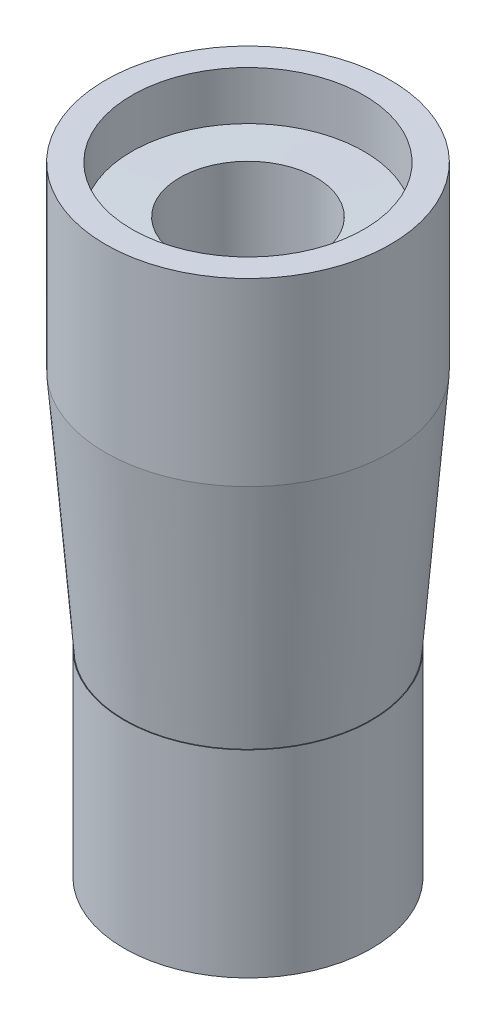
ISO-10303-21;
HEADER;
FILE_DESCRIPTION(('STEP AP214'),'2;1');
FILE_NAME('part.step','',(''),(''),'','','');
FILE_SCHEMA(('AUTOMOTIVE_DESIGN { 1 0 10303 214 1 1 1 1 }'));
ENDSEC;
DATA;
#1=APPLICATION_CONTEXT('core data for automotive mechanical design processes');
#2=APPLICATION_PROTOCOL_DEFINITION('international standard','automotive_design',2000,#1);
#3=PRODUCT_CONTEXT('',#1,'mechanical');
#4=PRODUCT('Part','Part','',(#3));
#5=PRODUCT_RELATED_PRODUCT_CATEGORY('part','',(#4));
#6=PRODUCT_DEFINITION_FORMATION('','',#4);
#7=PRODUCT_DEFINITION_CONTEXT('part definition',#1,'design');
#8=PRODUCT_DEFINITION('design','',#6,#7);
#9=PRODUCT_DEFINITION_SHAPE('','',#8);
#10=(LENGTH_UNIT() NAMED_UNIT(*) SI_UNIT(.MILLI.,.METRE.));
#11=(NAMED_UNIT(*) PLANE_ANGLE_UNIT() SI_UNIT($,.RADIAN.));
#12=(NAMED_UNIT(*) SI_UNIT($,.STERADIAN.) SOLID_ANGLE_UNIT());
#13=UNCERTAINTY_MEASURE_WITH_UNIT(LENGTH_MEASURE(1.E-05),#10,'distance_accuracy_value','');
#14=(GEOMETRIC_REPRESENTATION_CONTEXT(3) GLOBAL_UNCERTAINTY_ASSIGNED_CONTEXT((#13)) GLOBAL_UNIT_ASSIGNED_CONTEXT((#10,
#11,#12)) REPRESENTATION_CONTEXT('',''));
#15=CARTESIAN_POINT('',(0.,0.,0.));
#16=DIRECTION('',(0.,0.,1.));
#17=DIRECTION('',(1.,0.,0.));
#18=AXIS2_PLACEMENT_3D('',#15,#16,#17);
#19=CARTESIAN_POINT('',(-25.6120969503537,30.0163177549968,0.));
#20=DIRECTION('',(0.,1.,0.));
#21=DIRECTION('',(0.,0.,1.));
#22=AXIS2_PLACEMENT_3D('',#19,#20,#21);
#23=PLANE('',#22);
#24=CARTESIAN_POINT('',(-14.7970969503537,30.0163177549968,0.));
#25=DIRECTION('',(0.,1.,0.));
#26=DIRECTION('',(0.,0.,1.));
#27=AXIS2_PLACEMENT_3D('',#24,#25,#26);
#28=CIRCLE('',#27,10.815);
#29=CARTESIAN_POINT('',(-14.7970969503537,30.0163177549968,10.815));
#30=VERTEX_POINT('',#29);
#31=EDGE_CURVE('E10',#30,#30,#28,.T.);
#32=ORIENTED_EDGE('',*,*,#31,.T.);
#33=EDGE_LOOP('',(#32));
#34=FACE_BOUND('',#33,.T.);
#35=CARTESIAN_POINT('',(-14.7970969503537,30.0163177549968,0.));
#36=DIRECTION('',(0.,1.,0.));
#37=DIRECTION('',(0.,0.,1.));
#38=AXIS2_PLACEMENT_3D('',#35,#36,#37);
#39=CIRCLE('',#38,8.81499999999999);
#40=CARTESIAN_POINT('',(-14.7970969503537,30.0163177549968,8.81499999999999));
#41=VERTEX_POINT('',#40);
#42=EDGE_CURVE('E50',#41,#41,#39,.T.);
#43=ORIENTED_EDGE('',*,*,#42,.F.);
#44=EDGE_LOOP('',(#43));
#45=FACE_BOUND('',#44,.T.);
#46=ADVANCED_FACE('F43',(#34,#45),#23,.T.);
#47=CARTESIAN_POINT('',(-14.7970969503537,26.4248387096774,0.));
#48=DIRECTION('',(0.,1.,0.));
#49=DIRECTION('',(0.,0.,1.));
#50=AXIS2_PLACEMENT_3D('',#47,#48,#49);
#51=CYLINDRICAL_SURFACE('',#50,8.81499999999999);
#52=ORIENTED_EDGE('',*,*,#42,.T.);
#53=EDGE_LOOP('',(#52));
#54=FACE_BOUND('',#53,.T.);
#55=CARTESIAN_POINT('',(-14.7970969503537,26.3263177549968,0.));
#56=DIRECTION('',(0.,1.,0.));
#57=DIRECTION('',(0.,0.,1.));
#58=AXIS2_PLACEMENT_3D('',#55,#56,#57);
#59=CIRCLE('',#58,8.815);
#60=CARTESIAN_POINT('',(-14.7970969503537,26.3263177549968,8.815));
#61=VERTEX_POINT('',#60);
#62=EDGE_CURVE('E55',#61,#61,#59,.T.);
#63=ORIENTED_EDGE('',*,*,#62,.F.);
#64=EDGE_LOOP('',(#63));
#65=FACE_BOUND('',#64,.T.);
#66=ADVANCED_FACE('F112',(#54,#65),#51,.F.);
#67=CARTESIAN_POINT('',(-14.7970969503537,26.4248387096774,0.));
#68=DIRECTION('',(0.,-1.,0.));
#69=DIRECTION('',(0.,0.,-1.));
#70=AXIS2_PLACEMENT_3D('',#67,#68,#69);
#71=CONICAL_SURFACE('',#70,5.175,1.543736736926);
#72=ORIENTED_EDGE('',*,*,#62,.T.);
#73=EDGE_LOOP('',(#72));
#74=FACE_BOUND('',#73,.T.);
#75=CARTESIAN_POINT('',(-14.7970969503537,26.4248387096774,0.));
#76=DIRECTION('',(0.,1.,0.));
#77=DIRECTION('',(0.,0.,1.));
#78=AXIS2_PLACEMENT_3D('',#75,#76,#77);
#79=CIRCLE('',#78,5.175);
#80=CARTESIAN_POINT('',(-14.7970969503537,26.4248387096774,5.175));
#81=VERTEX_POINT('',#80);
#82=EDGE_CURVE('E60',#81,#81,#79,.T.);
#83=ORIENTED_EDGE('',*,*,#82,.F.);
#84=EDGE_LOOP('',(#83));
#85=FACE_BOUND('',#84,.T.);
#86=ADVANCED_FACE('F116',(#74,#85),#71,.T.);
#87=CARTESIAN_POINT('',(-14.7970969503537,26.4248387096774,0.));
#88=DIRECTION('',(0.,1.,0.));
#89=DIRECTION('',(0.,0.,1.));
#90=AXIS2_PLACEMENT_3D('',#87,#88,#89);
#91=CYLINDRICAL_SURFACE('',#90,5.175);
#92=ORIENTED_EDGE('',*,*,#82,.T.);
#93=EDGE_LOOP('',(#92));
#94=FACE_BOUND('',#93,.T.);
#95=CARTESIAN_POINT('',(-14.7970969503537,-13.0751612903226,0.));
#96=DIRECTION('',(0.,1.,0.));
#97=DIRECTION('',(0.,0.,1.));
#98=AXIS2_PLACEMENT_3D('',#95,#96,#97);
#99=CIRCLE('',#98,5.17499999999999);
#100=CARTESIAN_POINT('',(-14.7970969503537,-13.0751612903226,5.17499999999999));
#101=VERTEX_POINT('',#100);
#102=EDGE_CURVE('E66',#101,#101,#99,.T.);
#103=ORIENTED_EDGE('',*,*,#102,.F.);
#104=EDGE_LOOP('',(#103));
#105=FACE_BOUND('',#104,.T.);
#106=ADVANCED_FACE('F121',(#94,#105),#91,.F.);
#107=CARTESIAN_POINT('',(-19.9720969503537,-13.0751612903226,0.));
#108=DIRECTION('',(0.,-1.,0.));
#109=DIRECTION('',(0.,0.,-1.));
#110=AXIS2_PLACEMENT_3D('',#107,#108,#109);
#111=PLANE('',#110);
#112=ORIENTED_EDGE('',*,*,#102,.T.);
#113=EDGE_LOOP('',(#112));
#114=FACE_BOUND('',#113,.T.);
#115=CARTESIAN_POINT('',(-14.7970969503537,-13.0751612903226,0.));
#116=DIRECTION('',(0.,1.,0.));
#117=DIRECTION('',(0.,0.,1.));
#118=AXIS2_PLACEMENT_3D('',#115,#116,#117);
#119=CIRCLE('',#118,6.9416027886641);
#120=CARTESIAN_POINT('',(-14.7970969503537,-13.0751612903226,6.9416027886641));
#121=VERTEX_POINT('',#120);
#122=EDGE_CURVE('E70',#121,#121,#119,.T.);
#123=ORIENTED_EDGE('',*,*,#122,.F.);
#124=EDGE_LOOP('',(#123));
#125=FACE_BOUND('',#124,.T.);
#126=ADVANCED_FACE('F128',(#114,#125),#111,.T.);
#127=CARTESIAN_POINT('',(-14.7970969503537,26.4248387096774,0.));
#128=DIRECTION('',(0.,1.,0.));
#129=DIRECTION('',(0.,0.,1.));
#130=AXIS2_PLACEMENT_3D('',#127,#128,#129);
#131=CYLINDRICAL_SURFACE('',#130,6.94160278866409);
#132=ORIENTED_EDGE('',*,*,#122,.T.);
#133=EDGE_LOOP('',(#132));
#134=FACE_BOUND('',#133,.T.);
#135=CARTESIAN_POINT('',(-14.7970969503537,-16.9873258973576,0.));
#136=DIRECTION('',(0.,1.,0.));
#137=DIRECTION('',(0.,0.,1.));
#138=AXIS2_PLACEMENT_3D('',#135,#136,#137);
#139=CIRCLE('',#138,6.94160278866409);
#140=CARTESIAN_POINT('',(-14.7970969503537,-16.9873258973576,6.94160278866409));
#141=VERTEX_POINT('',#140);
#142=EDGE_CURVE('E74',#141,#141,#139,.T.);
#143=ORIENTED_EDGE('',*,*,#142,.F.);
#144=EDGE_LOOP('',(#143));
#145=FACE_BOUND('',#144,.T.);
#146=ADVANCED_FACE('F132',(#134,#145),#131,.F.);
#147=CARTESIAN_POINT('',(-24.1995949232433,-16.9873258973576,0.));
#148=DIRECTION('',(0.,-1.,0.));
#149=DIRECTION('',(0.,0.,-1.));
#150=AXIS2_PLACEMENT_3D('',#147,#148,#149);
#151=PLANE('',#150);
#152=ORIENTED_EDGE('',*,*,#142,.T.);
#153=EDGE_LOOP('',(#152));
#154=FACE_BOUND('',#153,.T.);
#155=CARTESIAN_POINT('',(-14.7970969503537,-16.9873258973576,0.));
#156=DIRECTION('',(0.,1.,0.));
#157=DIRECTION('',(0.,0.,1.));
#158=AXIS2_PLACEMENT_3D('',#155,#156,#157);
#159=CIRCLE('',#158,9.40249797288959);
#160=CARTESIAN_POINT('',(-14.7970969503537,-16.9873258973576,9.40249797288959));
#161=VERTEX_POINT('',#160);
#162=EDGE_CURVE('E78',#161,#161,#159,.T.);
#163=ORIENTED_EDGE('',*,*,#162,.F.);
#164=EDGE_LOOP('',(#163));
#165=FACE_BOUND('',#164,.T.);
#166=ADVANCED_FACE('F136',(#154,#165),#151,.T.);
#167=CARTESIAN_POINT('',(-14.7970969503537,26.4248387096774,0.));
#168=DIRECTION('',(0.,1.,0.));
#169=DIRECTION('',(0.,0.,1.));
#170=AXIS2_PLACEMENT_3D('',#167,#168,#169);
#171=CYLINDRICAL_SURFACE('',#170,9.40249797288959);
#172=ORIENTED_EDGE('',*,*,#162,.T.);
#173=EDGE_LOOP('',(#172));
#174=FACE_BOUND('',#173,.T.);
#175=CARTESIAN_POINT('',(-14.7970969503537,-1.98732120336022,0.));
#176=DIRECTION('',(0.,1.,0.));
#177=DIRECTION('',(0.,0.,1.));
#178=AXIS2_PLACEMENT_3D('',#175,#176,#177);
#179=CIRCLE('',#178,9.40249797288959);
#180=CARTESIAN_POINT('',(-14.7970969503537,-1.98732120336022,9.40249797288959));
#181=VERTEX_POINT('',#180);
#182=EDGE_CURVE('E82',#181,#181,#179,.T.);
#183=ORIENTED_EDGE('',*,*,#182,.F.);
#184=EDGE_LOOP('',(#183));
#185=FACE_BOUND('',#184,.T.);
#186=ADVANCED_FACE('F108',(#174,#185),#171,.T.);
#187=CARTESIAN_POINT('',(-24.1495949232433,-1.98732120336023,0.));
#188=DIRECTION('',(0.,1.,0.));
#189=DIRECTION('',(0.,0.,1.));
#190=AXIS2_PLACEMENT_3D('',#187,#188,#189);
#191=PLANE('',#190);
#192=ORIENTED_EDGE('',*,*,#182,.T.);
#193=EDGE_LOOP('',(#192));
#194=FACE_BOUND('',#193,.T.);
#195=CARTESIAN_POINT('',(-14.7970969503537,-1.98732120336022,0.));
#196=DIRECTION('',(0.,1.,0.));
#197=DIRECTION('',(0.,0.,1.));
#198=AXIS2_PLACEMENT_3D('',#195,#196,#197);
#199=CIRCLE('',#198,9.35249797288959);
#200=CARTESIAN_POINT('',(-14.7970969503537,-1.98732120336022,9.35249797288959));
#201=VERTEX_POINT('',#200);
#202=EDGE_CURVE('E86',#201,#201,#199,.T.);
#203=ORIENTED_EDGE('',*,*,#202,.F.);
#204=EDGE_LOOP('',(#203));
#205=FACE_BOUND('',#204,.T.);
#206=ADVANCED_FACE('F100',(#194,#205),#191,.T.);
#207=CARTESIAN_POINT('',(-14.7970969503537,16.3263177549968,0.));
#208=DIRECTION('',(0.,1.,0.));
#209=DIRECTION('',(0.,0.,1.));
#210=AXIS2_PLACEMENT_3D('',#207,#208,#209);
#211=CONICAL_SURFACE('',#210,10.815,0.0796895082429434);
#212=ORIENTED_EDGE('',*,*,#202,.T.);
#213=EDGE_LOOP('',(#212));
#214=FACE_BOUND('',#213,.T.);
#215=CARTESIAN_POINT('',(-14.7970969503537,16.3263177549968,0.));
#216=DIRECTION('',(0.,1.,0.));
#217=DIRECTION('',(0.,0.,1.));
#218=AXIS2_PLACEMENT_3D('',#215,#216,#217);
#219=CIRCLE('',#218,10.815);
#220=CARTESIAN_POINT('',(-14.7970969503537,16.3263177549968,10.815));
#221=VERTEX_POINT('',#220);
#222=EDGE_CURVE('E90',#221,#221,#219,.T.);
#223=ORIENTED_EDGE('',*,*,#222,.F.);
#224=EDGE_LOOP('',(#223));
#225=FACE_BOUND('',#224,.T.);
#226=ADVANCED_FACE('F98',(#214,#225),#211,.T.);
#227=CARTESIAN_POINT('',(-14.7970969503537,26.4248387096774,0.));
#228=DIRECTION('',(0.,1.,0.));
#229=DIRECTION('',(0.,0.,1.));
#230=AXIS2_PLACEMENT_3D('',#227,#228,#229);
#231=CYLINDRICAL_SURFACE('',#230,10.815);
#232=ORIENTED_EDGE('',*,*,#222,.T.);
#233=EDGE_LOOP('',(#232));
#234=FACE_BOUND('',#233,.T.);
#235=ORIENTED_EDGE('',*,*,#31,.F.);
#236=EDGE_LOOP('',(#235));
#237=FACE_BOUND('',#236,.T.);
#238=ADVANCED_FACE('F95',(#234,#237),#231,.T.);
#239=CLOSED_SHELL('',(#46,#66,#86,#106,#126,#146,#166,#186,#206,#226,#238));
#240=MANIFOLD_SOLID_BREP('B2',#239);
#241=ADVANCED_BREP_SHAPE_REPRESENTATION('',(#18,#240),#14);
#242=SHAPE_DEFINITION_REPRESENTATION(#9,#241);
ENDSEC;
END-ISO-10303-21;
